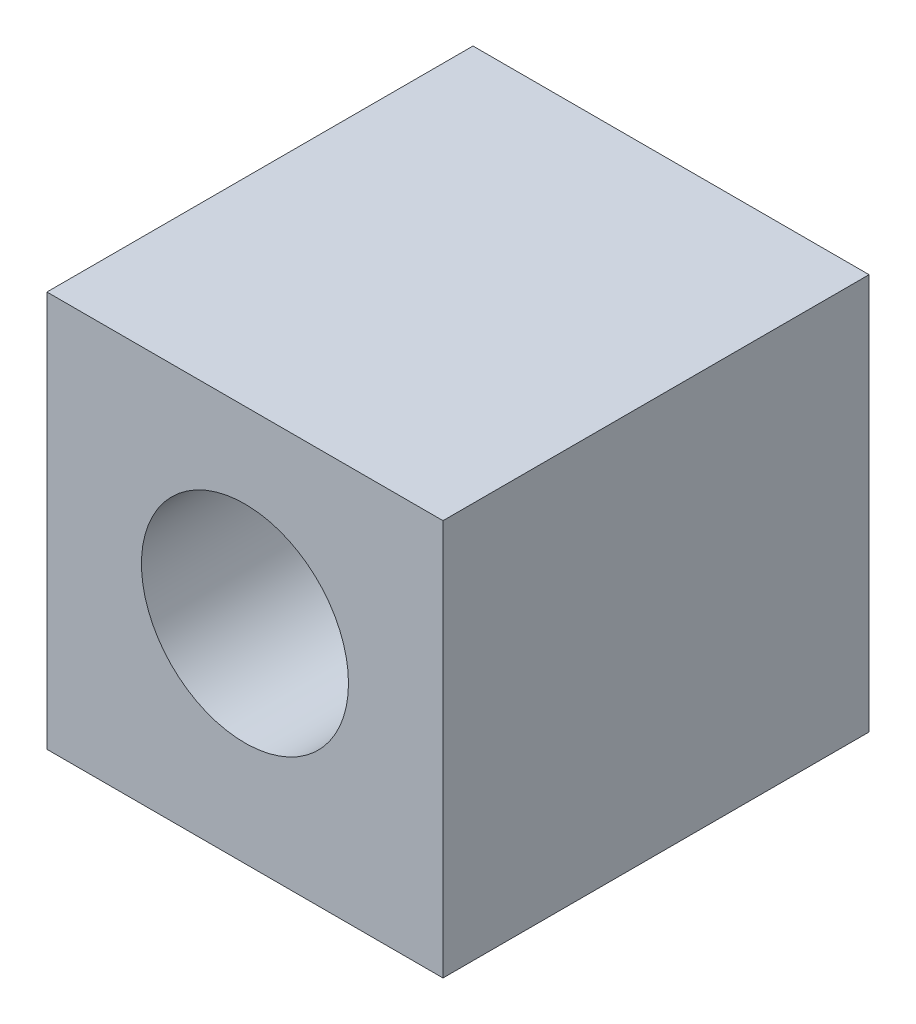
ISO-10303-21;
HEADER;
FILE_DESCRIPTION(('STEP AP214'),'2;1');
FILE_NAME('part.step','',(''),(''),'','','');
FILE_SCHEMA(('AUTOMOTIVE_DESIGN { 1 0 10303 214 1 1 1 1 }'));
ENDSEC;
DATA;
#1=APPLICATION_CONTEXT('core data for automotive mechanical design processes');
#2=APPLICATION_PROTOCOL_DEFINITION('international standard','automotive_design',2000,#1);
#3=PRODUCT_CONTEXT('',#1,'mechanical');
#4=PRODUCT('Part','Part','',(#3));
#5=PRODUCT_RELATED_PRODUCT_CATEGORY('part','',(#4));
#6=PRODUCT_DEFINITION_FORMATION('','',#4);
#7=PRODUCT_DEFINITION_CONTEXT('part definition',#1,'design');
#8=PRODUCT_DEFINITION('design','',#6,#7);
#9=PRODUCT_DEFINITION_SHAPE('','',#8);
#10=(LENGTH_UNIT() NAMED_UNIT(*) SI_UNIT(.MILLI.,.METRE.));
#11=(NAMED_UNIT(*) PLANE_ANGLE_UNIT() SI_UNIT($,.RADIAN.));
#12=(NAMED_UNIT(*) SI_UNIT($,.STERADIAN.) SOLID_ANGLE_UNIT());
#13=UNCERTAINTY_MEASURE_WITH_UNIT(LENGTH_MEASURE(1.E-05),#10,'distance_accuracy_value','');
#14=(GEOMETRIC_REPRESENTATION_CONTEXT(3) GLOBAL_UNCERTAINTY_ASSIGNED_CONTEXT((#13)) GLOBAL_UNIT_ASSIGNED_CONTEXT((#10,
#11,#12)) REPRESENTATION_CONTEXT('',''));
#15=CARTESIAN_POINT('',(0.,0.,0.));
#16=DIRECTION('',(0.,0.,1.));
#17=DIRECTION('',(1.,0.,0.));
#18=AXIS2_PLACEMENT_3D('',#15,#16,#17);
#19=CARTESIAN_POINT('',(0.,132.,142.));
#20=DIRECTION('',(0.,1.,0.));
#21=DIRECTION('',(0.,0.,1.));
#22=AXIS2_PLACEMENT_3D('',#19,#20,#21);
#23=PLANE('',#22);
#24=DIRECTION('',(1.,0.,0.));
#25=VECTOR('',#24,1.);
#26=CARTESIAN_POINT('',(0.,132.,0.));
#27=LINE('',#26,#25);
#28=CARTESIAN_POINT('',(0.,132.,0.));
#29=VERTEX_POINT('',#28);
#30=CARTESIAN_POINT('',(132.,132.,0.));
#31=VERTEX_POINT('',#30);
#32=EDGE_CURVE('E110',#29,#31,#27,.T.);
#33=ORIENTED_EDGE('',*,*,#32,.F.);
#34=DIRECTION('',(0.,0.,-1.));
#35=VECTOR('',#34,1.);
#36=CARTESIAN_POINT('',(0.,132.,142.));
#37=LINE('',#36,#35);
#38=CARTESIAN_POINT('',(0.,132.,142.));
#39=VERTEX_POINT('',#38);
#40=EDGE_CURVE('E11',#39,#29,#37,.T.);
#41=ORIENTED_EDGE('',*,*,#40,.F.);
#42=DIRECTION('',(1.,0.,0.));
#43=VECTOR('',#42,1.);
#44=CARTESIAN_POINT('',(0.,132.,142.));
#45=LINE('',#44,#43);
#46=CARTESIAN_POINT('',(132.,132.,142.));
#47=VERTEX_POINT('',#46);
#48=EDGE_CURVE('E101',#39,#47,#45,.T.);
#49=ORIENTED_EDGE('',*,*,#48,.T.);
#50=DIRECTION('',(0.,0.,-1.));
#51=VECTOR('',#50,1.);
#52=CARTESIAN_POINT('',(132.,132.,142.));
#53=LINE('',#52,#51);
#54=EDGE_CURVE('E42',#47,#31,#53,.T.);
#55=ORIENTED_EDGE('',*,*,#54,.T.);
#56=EDGE_LOOP('',(#33,#41,#49,#55));
#57=FACE_BOUND('',#56,.T.);
#58=ADVANCED_FACE('F39',(#57),#23,.T.);
#59=CARTESIAN_POINT('',(0.,0.,142.));
#60=DIRECTION('',(-1.,0.,0.));
#61=DIRECTION('',(0.,-1.,0.));
#62=AXIS2_PLACEMENT_3D('',#59,#60,#61);
#63=PLANE('',#62);
#64=DIRECTION('',(0.,1.,0.));
#65=VECTOR('',#64,1.);
#66=CARTESIAN_POINT('',(0.,0.,0.));
#67=LINE('',#66,#65);
#68=CARTESIAN_POINT('',(0.,0.,0.));
#69=VERTEX_POINT('',#68);
#70=EDGE_CURVE('E104',#69,#29,#67,.T.);
#71=ORIENTED_EDGE('',*,*,#70,.F.);
#72=DIRECTION('',(0.,0.,-1.));
#73=VECTOR('',#72,1.);
#74=CARTESIAN_POINT('',(0.,0.,142.));
#75=LINE('',#74,#73);
#76=CARTESIAN_POINT('',(0.,0.,142.));
#77=VERTEX_POINT('',#76);
#78=EDGE_CURVE('E49',#77,#69,#75,.T.);
#79=ORIENTED_EDGE('',*,*,#78,.F.);
#80=DIRECTION('',(0.,1.,0.));
#81=VECTOR('',#80,1.);
#82=CARTESIAN_POINT('',(0.,0.,142.));
#83=LINE('',#82,#81);
#84=EDGE_CURVE('E88',#77,#39,#83,.T.);
#85=ORIENTED_EDGE('',*,*,#84,.T.);
#86=ORIENTED_EDGE('',*,*,#40,.T.);
#87=EDGE_LOOP('',(#71,#79,#85,#86));
#88=FACE_BOUND('',#87,.T.);
#89=ADVANCED_FACE('F127',(#88),#63,.T.);
#90=CARTESIAN_POINT('',(0.,0.,142.));
#91=DIRECTION('',(0.,1.,0.));
#92=DIRECTION('',(0.,0.,1.));
#93=AXIS2_PLACEMENT_3D('',#90,#91,#92);
#94=PLANE('',#93);
#95=DIRECTION('',(1.,0.,0.));
#96=VECTOR('',#95,1.);
#97=CARTESIAN_POINT('',(0.,0.,0.));
#98=LINE('',#97,#96);
#99=CARTESIAN_POINT('',(132.,0.,0.));
#100=VERTEX_POINT('',#99);
#101=EDGE_CURVE('E94',#69,#100,#98,.T.);
#102=ORIENTED_EDGE('',*,*,#101,.T.);
#103=DIRECTION('',(0.,0.,-1.));
#104=VECTOR('',#103,1.);
#105=CARTESIAN_POINT('',(132.,0.,142.));
#106=LINE('',#105,#104);
#107=CARTESIAN_POINT('',(132.,0.,142.));
#108=VERTEX_POINT('',#107);
#109=EDGE_CURVE('E92',#108,#100,#106,.T.);
#110=ORIENTED_EDGE('',*,*,#109,.F.);
#111=DIRECTION('',(1.,0.,0.));
#112=VECTOR('',#111,1.);
#113=CARTESIAN_POINT('',(0.,0.,142.));
#114=LINE('',#113,#112);
#115=EDGE_CURVE('E85',#77,#108,#114,.T.);
#116=ORIENTED_EDGE('',*,*,#115,.F.);
#117=ORIENTED_EDGE('',*,*,#78,.T.);
#118=EDGE_LOOP('',(#102,#110,#116,#117));
#119=FACE_BOUND('',#118,.T.);
#120=ADVANCED_FACE('F93',(#119),#94,.F.);
#121=CARTESIAN_POINT('',(132.,0.,142.));
#122=DIRECTION('',(-1.,0.,0.));
#123=DIRECTION('',(0.,-1.,0.));
#124=AXIS2_PLACEMENT_3D('',#121,#122,#123);
#125=PLANE('',#124);
#126=DIRECTION('',(0.,1.,0.));
#127=VECTOR('',#126,1.);
#128=CARTESIAN_POINT('',(132.,0.,0.));
#129=LINE('',#128,#127);
#130=EDGE_CURVE('E114',#100,#31,#129,.T.);
#131=ORIENTED_EDGE('',*,*,#130,.T.);
#132=ORIENTED_EDGE('',*,*,#54,.F.);
#133=DIRECTION('',(0.,1.,0.));
#134=VECTOR('',#133,1.);
#135=CARTESIAN_POINT('',(132.,0.,142.));
#136=LINE('',#135,#134);
#137=EDGE_CURVE('E82',#108,#47,#136,.T.);
#138=ORIENTED_EDGE('',*,*,#137,.F.);
#139=ORIENTED_EDGE('',*,*,#109,.T.);
#140=EDGE_LOOP('',(#131,#132,#138,#139));
#141=FACE_BOUND('',#140,.T.);
#142=ADVANCED_FACE('F99',(#141),#125,.F.);
#143=CARTESIAN_POINT('',(0.,0.,142.));
#144=DIRECTION('',(0.,0.,1.));
#145=DIRECTION('',(1.,0.,0.));
#146=AXIS2_PLACEMENT_3D('',#143,#144,#145);
#147=PLANE('',#146);
#148=CARTESIAN_POINT('',(66.,69.3268873233311,142.));
#149=DIRECTION('',(0.,0.,1.));
#150=DIRECTION('',(1.,0.,0.));
#151=AXIS2_PLACEMENT_3D('',#148,#149,#150);
#152=CIRCLE('',#151,34.5);
#153=CARTESIAN_POINT('',(100.5,69.3268873233311,142.));
#154=VERTEX_POINT('',#153);
#155=EDGE_CURVE('E157',#154,#154,#152,.T.);
#156=ORIENTED_EDGE('',*,*,#155,.F.);
#157=EDGE_LOOP('',(#156));
#158=FACE_BOUND('',#157,.T.);
#159=ORIENTED_EDGE('',*,*,#48,.F.);
#160=ORIENTED_EDGE('',*,*,#84,.F.);
#161=ORIENTED_EDGE('',*,*,#115,.T.);
#162=ORIENTED_EDGE('',*,*,#137,.T.);
#163=EDGE_LOOP('',(#159,#160,#161,#162));
#164=FACE_BOUND('',#163,.T.);
#165=ADVANCED_FACE('F87',(#158,#164),#147,.T.);
#166=CARTESIAN_POINT('',(0.,0.,0.));
#167=DIRECTION('',(0.,0.,1.));
#168=DIRECTION('',(1.,0.,0.));
#169=AXIS2_PLACEMENT_3D('',#166,#167,#168);
#170=PLANE('',#169);
#171=CARTESIAN_POINT('',(66.,69.3268873233311,0.));
#172=DIRECTION('',(0.,0.,1.));
#173=DIRECTION('',(1.,0.,0.));
#174=AXIS2_PLACEMENT_3D('',#171,#172,#173);
#175=CIRCLE('',#174,34.5);
#176=CARTESIAN_POINT('',(100.5,69.3268873233311,0.));
#177=VERTEX_POINT('',#176);
#178=EDGE_CURVE('E115',#177,#177,#175,.T.);
#179=ORIENTED_EDGE('',*,*,#178,.T.);
#180=EDGE_LOOP('',(#179));
#181=FACE_BOUND('',#180,.T.);
#182=ORIENTED_EDGE('',*,*,#32,.T.);
#183=ORIENTED_EDGE('',*,*,#130,.F.);
#184=ORIENTED_EDGE('',*,*,#101,.F.);
#185=ORIENTED_EDGE('',*,*,#70,.T.);
#186=EDGE_LOOP('',(#182,#183,#184,#185));
#187=FACE_BOUND('',#186,.T.);
#188=ADVANCED_FACE('F126',(#181,#187),#170,.F.);
#189=CARTESIAN_POINT('',(66.,69.3268873233311,0.));
#190=DIRECTION('',(0.,0.,1.));
#191=DIRECTION('',(1.,0.,0.));
#192=AXIS2_PLACEMENT_3D('',#189,#190,#191);
#193=CYLINDRICAL_SURFACE('',#192,34.5);
#194=ORIENTED_EDGE('',*,*,#178,.F.);
#195=EDGE_LOOP('',(#194));
#196=FACE_BOUND('',#195,.T.);
#197=ORIENTED_EDGE('',*,*,#155,.T.);
#198=EDGE_LOOP('',(#197));
#199=FACE_BOUND('',#198,.T.);
#200=ADVANCED_FACE('F145',(#196,#199),#193,.F.);
#201=CLOSED_SHELL('',(#58,#89,#120,#142,#165,#188,#200));
#202=MANIFOLD_SOLID_BREP('B2',#201);
#203=ADVANCED_BREP_SHAPE_REPRESENTATION('',(#18,#202),#14);
#204=SHAPE_DEFINITION_REPRESENTATION(#9,#203);
ENDSEC;
END-ISO-10303-21;
